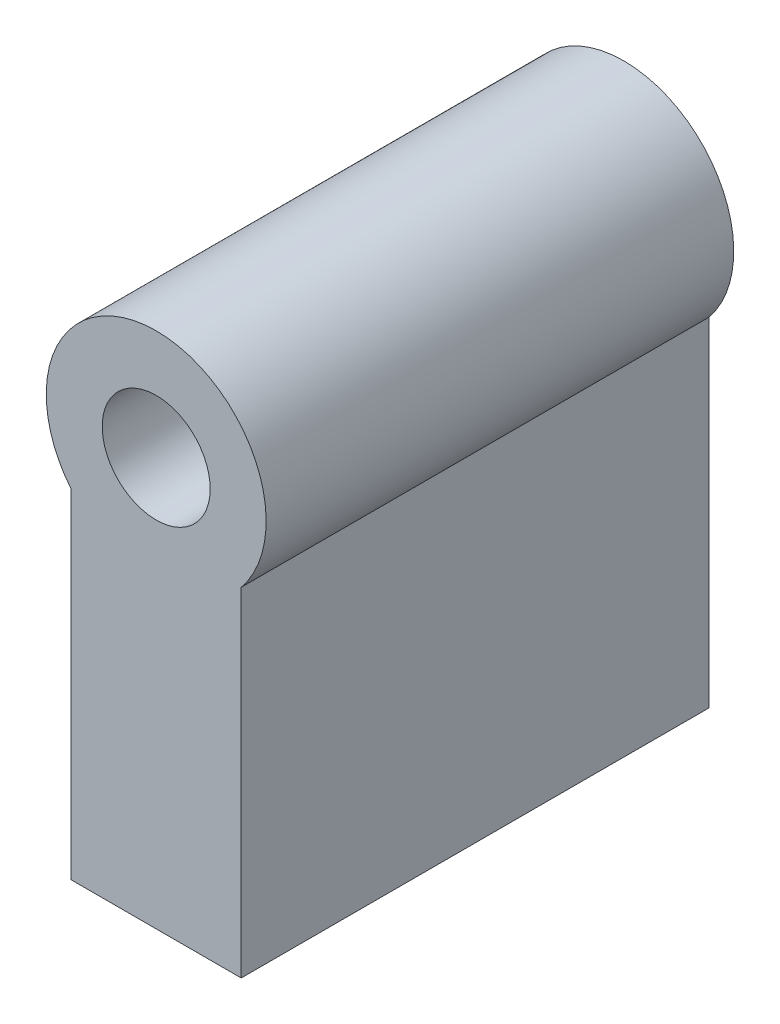
ISO-10303-21;
HEADER;
FILE_DESCRIPTION(('STEP AP214'),'2;1');
FILE_NAME('part.step','',(''),(''),'','','');
FILE_SCHEMA(('AUTOMOTIVE_DESIGN { 1 0 10303 214 1 1 1 1 }'));
ENDSEC;
DATA;
#1=APPLICATION_CONTEXT('core data for automotive mechanical design processes');
#2=APPLICATION_PROTOCOL_DEFINITION('international standard','automotive_design',2000,#1);
#3=PRODUCT_CONTEXT('',#1,'mechanical');
#4=PRODUCT('Part','Part','',(#3));
#5=PRODUCT_RELATED_PRODUCT_CATEGORY('part','',(#4));
#6=PRODUCT_DEFINITION_FORMATION('','',#4);
#7=PRODUCT_DEFINITION_CONTEXT('part definition',#1,'design');
#8=PRODUCT_DEFINITION('design','',#6,#7);
#9=PRODUCT_DEFINITION_SHAPE('','',#8);
#10=(LENGTH_UNIT() NAMED_UNIT(*) SI_UNIT(.MILLI.,.METRE.));
#11=(NAMED_UNIT(*) PLANE_ANGLE_UNIT() SI_UNIT($,.RADIAN.));
#12=(NAMED_UNIT(*) SI_UNIT($,.STERADIAN.) SOLID_ANGLE_UNIT());
#13=UNCERTAINTY_MEASURE_WITH_UNIT(LENGTH_MEASURE(1.E-05),#10,'distance_accuracy_value','');
#14=(GEOMETRIC_REPRESENTATION_CONTEXT(3) GLOBAL_UNCERTAINTY_ASSIGNED_CONTEXT((#13)) GLOBAL_UNIT_ASSIGNED_CONTEXT((#10,
#11,#12)) REPRESENTATION_CONTEXT('',''));
#15=CARTESIAN_POINT('',(0.,0.,0.));
#16=DIRECTION('',(0.,0.,1.));
#17=DIRECTION('',(1.,0.,0.));
#18=AXIS2_PLACEMENT_3D('',#15,#16,#17);
#19=CARTESIAN_POINT('',(0.,0.,55.));
#20=DIRECTION('',(1.,0.,0.));
#21=DIRECTION('',(0.,1.,0.));
#22=AXIS2_PLACEMENT_3D('',#19,#20,#21);
#23=PLANE('',#22);
#24=DIRECTION('',(0.,-1.,0.));
#25=VECTOR('',#24,1.);
#26=CARTESIAN_POINT('',(0.,0.,0.));
#27=LINE('',#26,#25);
#28=CARTESIAN_POINT('',(0.,4.80196097281442,0.));
#29=VERTEX_POINT('',#28);
#30=CARTESIAN_POINT('',(0.,-35.,0.));
#31=VERTEX_POINT('',#30);
#32=EDGE_CURVE('E76',#29,#31,#27,.T.);
#33=ORIENTED_EDGE('',*,*,#32,.T.);
#34=DIRECTION('',(0.,0.,-1.));
#35=VECTOR('',#34,1.);
#36=CARTESIAN_POINT('',(0.,-35.,55.));
#37=LINE('',#36,#35);
#38=CARTESIAN_POINT('',(0.,-35.,55.));
#39=VERTEX_POINT('',#38);
#40=EDGE_CURVE('E11',#39,#31,#37,.T.);
#41=ORIENTED_EDGE('',*,*,#40,.F.);
#42=DIRECTION('',(0.,-1.,0.));
#43=VECTOR('',#42,1.);
#44=CARTESIAN_POINT('',(0.,0.,55.));
#45=LINE('',#44,#43);
#46=CARTESIAN_POINT('',(0.,4.80196097281442,55.));
#47=VERTEX_POINT('',#46);
#48=EDGE_CURVE('E81',#47,#39,#45,.T.);
#49=ORIENTED_EDGE('',*,*,#48,.F.);
#50=DIRECTION('',(0.,0.,-1.));
#51=VECTOR('',#50,1.);
#52=CARTESIAN_POINT('',(0.,4.80196097281442,55.));
#53=LINE('',#52,#51);
#54=EDGE_CURVE('E97',#47,#29,#53,.T.);
#55=ORIENTED_EDGE('',*,*,#54,.T.);
#56=EDGE_LOOP('',(#33,#41,#49,#55));
#57=FACE_BOUND('',#56,.T.);
#58=ADVANCED_FACE('F37',(#57),#23,.F.);
#59=CARTESIAN_POINT('',(0.,-35.,55.));
#60=DIRECTION('',(0.,1.,0.));
#61=DIRECTION('',(0.,0.,1.));
#62=AXIS2_PLACEMENT_3D('',#59,#60,#61);
#63=PLANE('',#62);
#64=DIRECTION('',(1.,0.,0.));
#65=VECTOR('',#64,1.);
#66=CARTESIAN_POINT('',(0.,-35.,0.));
#67=LINE('',#66,#65);
#68=CARTESIAN_POINT('',(20.,-35.,0.));
#69=VERTEX_POINT('',#68);
#70=EDGE_CURVE('E93',#31,#69,#67,.T.);
#71=ORIENTED_EDGE('',*,*,#70,.T.);
#72=DIRECTION('',(0.,0.,-1.));
#73=VECTOR('',#72,1.);
#74=CARTESIAN_POINT('',(20.,-35.,55.));
#75=LINE('',#74,#73);
#76=CARTESIAN_POINT('',(20.,-35.,55.));
#77=VERTEX_POINT('',#76);
#78=EDGE_CURVE('E45',#77,#69,#75,.T.);
#79=ORIENTED_EDGE('',*,*,#78,.F.);
#80=DIRECTION('',(1.,0.,0.));
#81=VECTOR('',#80,1.);
#82=CARTESIAN_POINT('',(0.,-35.,55.));
#83=LINE('',#82,#81);
#84=EDGE_CURVE('E84',#39,#77,#83,.T.);
#85=ORIENTED_EDGE('',*,*,#84,.F.);
#86=ORIENTED_EDGE('',*,*,#40,.T.);
#87=EDGE_LOOP('',(#71,#79,#85,#86));
#88=FACE_BOUND('',#87,.T.);
#89=ADVANCED_FACE('F92',(#88),#63,.F.);
#90=CARTESIAN_POINT('',(20.,0.,55.));
#91=DIRECTION('',(-1.,0.,0.));
#92=DIRECTION('',(0.,0.,1.));
#93=AXIS2_PLACEMENT_3D('',#90,#91,#92);
#94=PLANE('',#93);
#95=DIRECTION('',(0.,1.,0.));
#96=VECTOR('',#95,1.);
#97=CARTESIAN_POINT('',(20.,0.,0.));
#98=LINE('',#97,#96);
#99=CARTESIAN_POINT('',(20.,4.80196097281443,0.));
#100=VERTEX_POINT('',#99);
#101=EDGE_CURVE('E69',#69,#100,#98,.T.);
#102=ORIENTED_EDGE('',*,*,#101,.T.);
#103=DIRECTION('',(0.,0.,-1.));
#104=VECTOR('',#103,1.);
#105=CARTESIAN_POINT('',(20.,4.80196097281443,55.));
#106=LINE('',#105,#104);
#107=CARTESIAN_POINT('',(20.,4.80196097281443,55.));
#108=VERTEX_POINT('',#107);
#109=EDGE_CURVE('E94',#108,#100,#106,.T.);
#110=ORIENTED_EDGE('',*,*,#109,.F.);
#111=DIRECTION('',(0.,1.,0.));
#112=VECTOR('',#111,1.);
#113=CARTESIAN_POINT('',(20.,0.,55.));
#114=LINE('',#113,#112);
#115=EDGE_CURVE('E88',#77,#108,#114,.T.);
#116=ORIENTED_EDGE('',*,*,#115,.F.);
#117=ORIENTED_EDGE('',*,*,#78,.T.);
#118=EDGE_LOOP('',(#102,#110,#116,#117));
#119=FACE_BOUND('',#118,.T.);
#120=ADVANCED_FACE('F95',(#119),#94,.F.);
#121=CARTESIAN_POINT('',(10.,13.,55.));
#122=DIRECTION('',(0.,0.,-1.));
#123=DIRECTION('',(-1.,0.,0.));
#124=AXIS2_PLACEMENT_3D('',#121,#122,#123);
#125=CYLINDRICAL_SURFACE('',#124,12.9308872043359);
#126=CARTESIAN_POINT('',(10.,13.,0.));
#127=DIRECTION('',(0.,0.,1.));
#128=DIRECTION('',(1.,0.,0.));
#129=AXIS2_PLACEMENT_3D('',#126,#127,#128);
#130=CIRCLE('',#129,12.9308872043359);
#131=EDGE_CURVE('E105',#100,#29,#130,.T.);
#132=ORIENTED_EDGE('',*,*,#131,.T.);
#133=ORIENTED_EDGE('',*,*,#54,.F.);
#134=CARTESIAN_POINT('',(10.,13.,55.));
#135=DIRECTION('',(0.,0.,1.));
#136=DIRECTION('',(1.,0.,0.));
#137=AXIS2_PLACEMENT_3D('',#134,#135,#136);
#138=CIRCLE('',#137,12.9308872043359);
#139=EDGE_CURVE('E53',#108,#47,#138,.T.);
#140=ORIENTED_EDGE('',*,*,#139,.F.);
#141=ORIENTED_EDGE('',*,*,#109,.T.);
#142=EDGE_LOOP('',(#132,#133,#140,#141));
#143=FACE_BOUND('',#142,.T.);
#144=ADVANCED_FACE('F110',(#143),#125,.T.);
#145=CARTESIAN_POINT('',(10.,13.,55.));
#146=DIRECTION('',(0.,0.,1.));
#147=DIRECTION('',(1.,0.,0.));
#148=AXIS2_PLACEMENT_3D('',#145,#146,#147);
#149=PLANE('',#148);
#150=CARTESIAN_POINT('',(10.,13.,55.));
#151=DIRECTION('',(0.,0.,1.));
#152=DIRECTION('',(1.,0.,0.));
#153=AXIS2_PLACEMENT_3D('',#150,#151,#152);
#154=CIRCLE('',#153,6.35);
#155=CARTESIAN_POINT('',(16.35,13.,55.));
#156=VERTEX_POINT('',#155);
#157=EDGE_CURVE('E132',#156,#156,#154,.T.);
#158=ORIENTED_EDGE('',*,*,#157,.F.);
#159=EDGE_LOOP('',(#158));
#160=FACE_BOUND('',#159,.T.);
#161=ORIENTED_EDGE('',*,*,#48,.T.);
#162=ORIENTED_EDGE('',*,*,#84,.T.);
#163=ORIENTED_EDGE('',*,*,#115,.T.);
#164=ORIENTED_EDGE('',*,*,#139,.T.);
#165=EDGE_LOOP('',(#161,#162,#163,#164));
#166=FACE_BOUND('',#165,.T.);
#167=ADVANCED_FACE('F86',(#160,#166),#149,.T.);
#168=CARTESIAN_POINT('',(10.,13.,0.));
#169=DIRECTION('',(0.,0.,1.));
#170=DIRECTION('',(1.,0.,0.));
#171=AXIS2_PLACEMENT_3D('',#168,#169,#170);
#172=PLANE('',#171);
#173=CARTESIAN_POINT('',(10.,13.,0.));
#174=DIRECTION('',(0.,0.,1.));
#175=DIRECTION('',(1.,0.,0.));
#176=AXIS2_PLACEMENT_3D('',#173,#174,#175);
#177=CIRCLE('',#176,6.35);
#178=CARTESIAN_POINT('',(16.35,13.,0.));
#179=VERTEX_POINT('',#178);
#180=EDGE_CURVE('E102',#179,#179,#177,.T.);
#181=ORIENTED_EDGE('',*,*,#180,.T.);
#182=EDGE_LOOP('',(#181));
#183=FACE_BOUND('',#182,.T.);
#184=ORIENTED_EDGE('',*,*,#32,.F.);
#185=ORIENTED_EDGE('',*,*,#131,.F.);
#186=ORIENTED_EDGE('',*,*,#101,.F.);
#187=ORIENTED_EDGE('',*,*,#70,.F.);
#188=EDGE_LOOP('',(#184,#185,#186,#187));
#189=FACE_BOUND('',#188,.T.);
#190=ADVANCED_FACE('F111',(#183,#189),#172,.F.);
#191=CARTESIAN_POINT('',(10.,13.,0.));
#192=DIRECTION('',(0.,0.,1.));
#193=DIRECTION('',(1.,0.,0.));
#194=AXIS2_PLACEMENT_3D('',#191,#192,#193);
#195=CYLINDRICAL_SURFACE('',#194,6.35);
#196=ORIENTED_EDGE('',*,*,#180,.F.);
#197=EDGE_LOOP('',(#196));
#198=FACE_BOUND('',#197,.T.);
#199=ORIENTED_EDGE('',*,*,#157,.T.);
#200=EDGE_LOOP('',(#199));
#201=FACE_BOUND('',#200,.T.);
#202=ADVANCED_FACE('F113',(#198,#201),#195,.F.);
#203=CLOSED_SHELL('',(#58,#89,#120,#144,#167,#190,#202));
#204=MANIFOLD_SOLID_BREP('B2',#203);
#205=ADVANCED_BREP_SHAPE_REPRESENTATION('',(#18,#204),#14);
#206=SHAPE_DEFINITION_REPRESENTATION(#9,#205);
ENDSEC;
END-ISO-10303-21;
